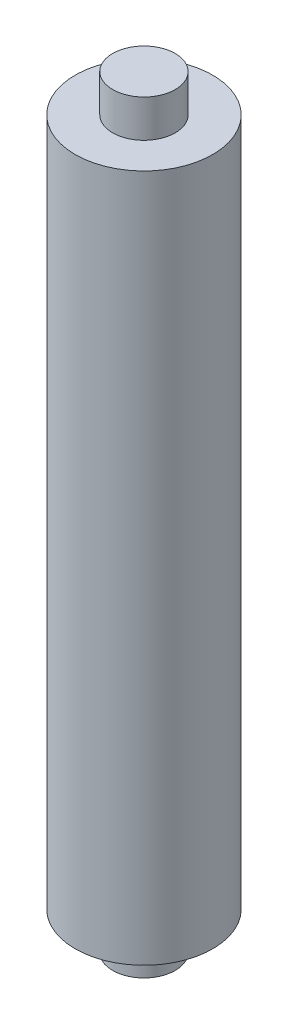
ISO-10303-21;
HEADER;
FILE_DESCRIPTION(('STEP AP214'),'2;1');
FILE_NAME('part.step','',(''),(''),'','','');
FILE_SCHEMA(('AUTOMOTIVE_DESIGN { 1 0 10303 214 1 1 1 1 }'));
ENDSEC;
DATA;
#1=APPLICATION_CONTEXT('core data for automotive mechanical design processes');
#2=APPLICATION_PROTOCOL_DEFINITION('international standard','automotive_design',2000,#1);
#3=PRODUCT_CONTEXT('',#1,'mechanical');
#4=PRODUCT('Part','Part','',(#3));
#5=PRODUCT_RELATED_PRODUCT_CATEGORY('part','',(#4));
#6=PRODUCT_DEFINITION_FORMATION('','',#4);
#7=PRODUCT_DEFINITION_CONTEXT('part definition',#1,'design');
#8=PRODUCT_DEFINITION('design','',#6,#7);
#9=PRODUCT_DEFINITION_SHAPE('','',#8);
#10=(LENGTH_UNIT() NAMED_UNIT(*) SI_UNIT(.MILLI.,.METRE.));
#11=(NAMED_UNIT(*) PLANE_ANGLE_UNIT() SI_UNIT($,.RADIAN.));
#12=(NAMED_UNIT(*) SI_UNIT($,.STERADIAN.) SOLID_ANGLE_UNIT());
#13=UNCERTAINTY_MEASURE_WITH_UNIT(LENGTH_MEASURE(1.E-05),#10,'distance_accuracy_value','');
#14=(GEOMETRIC_REPRESENTATION_CONTEXT(3) GLOBAL_UNCERTAINTY_ASSIGNED_CONTEXT((#13)) GLOBAL_UNIT_ASSIGNED_CONTEXT((#10,
#11,#12)) REPRESENTATION_CONTEXT('',''));
#15=CARTESIAN_POINT('',(0.,0.,0.));
#16=DIRECTION('',(0.,0.,1.));
#17=DIRECTION('',(1.,0.,0.));
#18=AXIS2_PLACEMENT_3D('',#15,#16,#17);
#19=CARTESIAN_POINT('',(0.,30.5,0.));
#20=DIRECTION('',(0.,-1.,0.));
#21=DIRECTION('',(0.,0.,-1.));
#22=AXIS2_PLACEMENT_3D('',#19,#20,#21);
#23=CYLINDRICAL_SURFACE('',#22,2.5);
#24=CARTESIAN_POINT('',(0.,27.5,0.));
#25=DIRECTION('',(0.,1.,0.));
#26=DIRECTION('',(0.,0.,1.));
#27=AXIS2_PLACEMENT_3D('',#24,#25,#26);
#28=CIRCLE('',#27,2.5);
#29=CARTESIAN_POINT('',(0.,27.5,-2.5));
#30=VERTEX_POINT('',#29);
#31=EDGE_CURVE('E42',#30,#30,#28,.T.);
#32=CARTESIAN_POINT('',(0.,30.5,0.));
#33=DIRECTION('',(0.,1.,0.));
#34=DIRECTION('',(0.,0.,1.));
#35=AXIS2_PLACEMENT_3D('',#32,#33,#34);
#36=CIRCLE('',#35,2.5);
#37=CARTESIAN_POINT('',(0.,30.5,-2.5));
#38=VERTEX_POINT('',#37);
#39=EDGE_CURVE('E46',#38,#38,#36,.T.);
#40=CARTESIAN_POINT('',(0.,27.5,-2.5));
#41=CARTESIAN_POINT('',(0.,27.53125,-2.5));
#42=CARTESIAN_POINT('',(0.,27.5625,-2.5));
#43=CARTESIAN_POINT('',(0.,27.625,-2.5));
#44=CARTESIAN_POINT('',(0.,27.65625,-2.5));
#45=CARTESIAN_POINT('',(0.,27.71875,-2.5));
#46=CARTESIAN_POINT('',(0.,27.75,-2.5));
#47=CARTESIAN_POINT('',(0.,27.8125,-2.5));
#48=CARTESIAN_POINT('',(0.,27.84375,-2.5));
#49=CARTESIAN_POINT('',(0.,27.90625,-2.5));
#50=CARTESIAN_POINT('',(0.,27.9375,-2.5));
#51=CARTESIAN_POINT('',(0.,28.,-2.5));
#52=CARTESIAN_POINT('',(0.,28.03125,-2.5));
#53=CARTESIAN_POINT('',(0.,28.09375,-2.5));
#54=CARTESIAN_POINT('',(0.,28.125,-2.5));
#55=CARTESIAN_POINT('',(0.,28.1875,-2.5));
#56=CARTESIAN_POINT('',(0.,28.21875,-2.5));
#57=CARTESIAN_POINT('',(0.,28.28125,-2.5));
#58=CARTESIAN_POINT('',(0.,28.3125,-2.5));
#59=CARTESIAN_POINT('',(0.,28.375,-2.5));
#60=CARTESIAN_POINT('',(0.,28.40625,-2.5));
#61=CARTESIAN_POINT('',(0.,28.46875,-2.5));
#62=CARTESIAN_POINT('',(0.,28.5,-2.5));
#63=CARTESIAN_POINT('',(0.,28.5625,-2.5));
#64=CARTESIAN_POINT('',(0.,28.59375,-2.5));
#65=CARTESIAN_POINT('',(0.,28.65625,-2.5));
#66=CARTESIAN_POINT('',(0.,28.6875,-2.5));
#67=CARTESIAN_POINT('',(0.,28.75,-2.5));
#68=CARTESIAN_POINT('',(0.,28.78125,-2.5));
#69=CARTESIAN_POINT('',(0.,28.84375,-2.5));
#70=CARTESIAN_POINT('',(0.,28.875,-2.5));
#71=CARTESIAN_POINT('',(0.,28.9375,-2.5));
#72=CARTESIAN_POINT('',(0.,28.96875,-2.5));
#73=CARTESIAN_POINT('',(0.,29.03125,-2.5));
#74=CARTESIAN_POINT('',(0.,29.0625,-2.5));
#75=CARTESIAN_POINT('',(0.,29.125,-2.5));
#76=CARTESIAN_POINT('',(0.,29.15625,-2.5));
#77=CARTESIAN_POINT('',(0.,29.21875,-2.5));
#78=CARTESIAN_POINT('',(0.,29.25,-2.5));
#79=CARTESIAN_POINT('',(0.,29.3125,-2.5));
#80=CARTESIAN_POINT('',(0.,29.34375,-2.5));
#81=CARTESIAN_POINT('',(0.,29.40625,-2.5));
#82=CARTESIAN_POINT('',(0.,29.4375,-2.5));
#83=CARTESIAN_POINT('',(0.,29.5,-2.5));
#84=CARTESIAN_POINT('',(0.,29.53125,-2.5));
#85=CARTESIAN_POINT('',(0.,29.59375,-2.5));
#86=CARTESIAN_POINT('',(0.,29.625,-2.5));
#87=CARTESIAN_POINT('',(0.,29.6875,-2.5));
#88=CARTESIAN_POINT('',(0.,29.71875,-2.5));
#89=CARTESIAN_POINT('',(0.,29.78125,-2.5));
#90=CARTESIAN_POINT('',(0.,29.8125,-2.5));
#91=CARTESIAN_POINT('',(0.,29.875,-2.5));
#92=CARTESIAN_POINT('',(0.,29.90625,-2.5));
#93=CARTESIAN_POINT('',(0.,29.96875,-2.5));
#94=CARTESIAN_POINT('',(0.,30.,-2.5));
#95=CARTESIAN_POINT('',(0.,30.0625,-2.5));
#96=CARTESIAN_POINT('',(0.,30.09375,-2.5));
#97=CARTESIAN_POINT('',(0.,30.15625,-2.5));
#98=CARTESIAN_POINT('',(0.,30.1875,-2.5));
#99=CARTESIAN_POINT('',(0.,30.25,-2.5));
#100=CARTESIAN_POINT('',(0.,30.28125,-2.5));
#101=CARTESIAN_POINT('',(0.,30.34375,-2.5));
#102=CARTESIAN_POINT('',(0.,30.375,-2.5));
#103=CARTESIAN_POINT('',(0.,30.4375,-2.5));
#104=CARTESIAN_POINT('',(0.,30.46875,-2.5));
#105=CARTESIAN_POINT('',(0.,30.5,-2.5));
#106=B_SPLINE_CURVE_WITH_KNOTS('',3,(#40,#41,#42,#43,#44,#45,#46,#47,#48,#49,#50,#51,#52,#53,
#54,#55,#56,#57,#58,#59,#60,#61,#62,#63,#64,#65,#66,#67,#68,#69,#70,#71,#72,#73,#74,#75,#76,#77,
#78,#79,#80,#81,#82,#83,#84,#85,#86,#87,#88,#89,#90,#91,#92,#93,#94,#95,#96,#97,#98,#99,#100,
#101,#102,#103,#104,#105),.UNSPECIFIED.,.F.,.F.,(4,2,2,2,2,2,2,2,2,2,2,2,2,2,2,2,2,2,2,2,2,2,2,
2,2,2,2,2,2,2,2,2,4),(0.,0.0937500000000001,0.1875,0.28125,0.374999999999997,0.46875,
0.562499999999997,0.656249999999997,0.749999999999997,0.843749999999997,0.937499999999997,
1.03125,1.125,1.21875,1.3125,1.40625,1.5,1.59375,1.6875,1.78125,1.875,1.96875,2.0625,2.15625,
2.25,2.34375,2.4375,2.53125,2.625,2.71875,2.8125,2.90625,3.),.UNSPECIFIED.);
#107=EDGE_CURVE('BSEAM39',#30,#38,#106,.T.);
#108=ORIENTED_EDGE('',*,*,#31,.T.);
#109=ORIENTED_EDGE('',*,*,#39,.F.);
#110=ORIENTED_EDGE('',*,*,#107,.T.);
#111=ORIENTED_EDGE('',*,*,#107,.F.);
#112=EDGE_LOOP('',(#108,#110,#109,#111));
#113=FACE_BOUND('',#112,.T.);
#114=ADVANCED_FACE('F39',(#113),#23,.T.);
#115=CARTESIAN_POINT('',(0.,30.5,0.));
#116=DIRECTION('',(0.,1.,0.));
#117=DIRECTION('',(0.,0.,1.));
#118=AXIS2_PLACEMENT_3D('',#115,#116,#117);
#119=PLANE('',#118);
#120=ORIENTED_EDGE('',*,*,#39,.T.);
#121=EDGE_LOOP('',(#120));
#122=FACE_BOUND('',#121,.T.);
#123=ADVANCED_FACE('F78',(#122),#119,.T.);
#124=CARTESIAN_POINT('',(0.,27.5,0.));
#125=DIRECTION('',(0.,-1.,0.));
#126=DIRECTION('',(0.,0.,-1.));
#127=AXIS2_PLACEMENT_3D('',#124,#125,#126);
#128=CYLINDRICAL_SURFACE('',#127,5.5);
#129=CARTESIAN_POINT('',(0.,27.5,0.));
#130=DIRECTION('',(0.,1.,0.));
#131=DIRECTION('',(0.,0.,1.));
#132=AXIS2_PLACEMENT_3D('',#129,#130,#131);
#133=CIRCLE('',#132,5.5);
#134=CARTESIAN_POINT('',(0.,27.5,5.5));
#135=VERTEX_POINT('',#134);
#136=EDGE_CURVE('E58',#135,#135,#133,.T.);
#137=ORIENTED_EDGE('',*,*,#136,.F.);
#138=EDGE_LOOP('',(#137));
#139=FACE_BOUND('',#138,.T.);
#140=CARTESIAN_POINT('',(0.,-27.5,0.));
#141=DIRECTION('',(0.,1.,0.));
#142=DIRECTION('',(0.,0.,1.));
#143=AXIS2_PLACEMENT_3D('',#140,#141,#142);
#144=CIRCLE('',#143,5.5);
#145=CARTESIAN_POINT('',(0.,-27.5,5.5));
#146=VERTEX_POINT('',#145);
#147=EDGE_CURVE('E55',#146,#146,#144,.T.);
#148=ORIENTED_EDGE('',*,*,#147,.T.);
#149=EDGE_LOOP('',(#148));
#150=FACE_BOUND('',#149,.T.);
#151=ADVANCED_FACE('F70',(#139,#150),#128,.T.);
#152=CARTESIAN_POINT('',(0.,27.5,0.));
#153=DIRECTION('',(0.,1.,0.));
#154=DIRECTION('',(0.,0.,1.));
#155=AXIS2_PLACEMENT_3D('',#152,#153,#154);
#156=PLANE('',#155);
#157=ORIENTED_EDGE('',*,*,#31,.F.);
#158=EDGE_LOOP('',(#157));
#159=FACE_BOUND('',#158,.T.);
#160=ORIENTED_EDGE('',*,*,#136,.T.);
#161=EDGE_LOOP('',(#160));
#162=FACE_BOUND('',#161,.T.);
#163=ADVANCED_FACE('F67',(#159,#162),#156,.T.);
#164=CARTESIAN_POINT('',(0.,-27.5,0.));
#165=DIRECTION('',(0.,1.,0.));
#166=DIRECTION('',(0.,0.,1.));
#167=AXIS2_PLACEMENT_3D('',#164,#165,#166);
#168=PLANE('',#167);
#169=CARTESIAN_POINT('',(0.,-27.5,0.));
#170=DIRECTION('',(0.,1.,0.));
#171=DIRECTION('',(0.,0.,1.));
#172=AXIS2_PLACEMENT_3D('',#169,#170,#171);
#173=CIRCLE('',#172,2.5);
#174=CARTESIAN_POINT('',(0.,-27.5,-2.5));
#175=VERTEX_POINT('',#174);
#176=EDGE_CURVE('E10',#175,#175,#173,.T.);
#177=ORIENTED_EDGE('',*,*,#176,.T.);
#178=EDGE_LOOP('',(#177));
#179=FACE_BOUND('',#178,.T.);
#180=ORIENTED_EDGE('',*,*,#147,.F.);
#181=EDGE_LOOP('',(#180));
#182=FACE_BOUND('',#181,.T.);
#183=ADVANCED_FACE('F69',(#179,#182),#168,.F.);
#184=CARTESIAN_POINT('',(0.,-30.5,0.));
#185=DIRECTION('',(0.,1.,0.));
#186=DIRECTION('',(0.,0.,1.));
#187=AXIS2_PLACEMENT_3D('',#184,#185,#186);
#188=PLANE('',#187);
#189=CARTESIAN_POINT('',(0.,-30.5,0.));
#190=DIRECTION('',(0.,1.,0.));
#191=DIRECTION('',(0.,0.,1.));
#192=AXIS2_PLACEMENT_3D('',#189,#190,#191);
#193=CIRCLE('',#192,2.5);
#194=CARTESIAN_POINT('',(0.,-30.5,-2.5));
#195=VERTEX_POINT('',#194);
#196=EDGE_CURVE('E50',#195,#195,#193,.T.);
#197=ORIENTED_EDGE('',*,*,#196,.F.);
#198=EDGE_LOOP('',(#197));
#199=FACE_BOUND('',#198,.T.);
#200=ADVANCED_FACE('F76',(#199),#188,.F.);
#201=CARTESIAN_POINT('',(0.,-30.5,-2.5));
#202=CARTESIAN_POINT('',(0.,-30.46875,-2.5));
#203=CARTESIAN_POINT('',(0.,-30.4375,-2.5));
#204=CARTESIAN_POINT('',(0.,-30.375,-2.5));
#205=CARTESIAN_POINT('',(0.,-30.34375,-2.5));
#206=CARTESIAN_POINT('',(0.,-30.28125,-2.5));
#207=CARTESIAN_POINT('',(0.,-30.25,-2.5));
#208=CARTESIAN_POINT('',(0.,-30.1875,-2.5));
#209=CARTESIAN_POINT('',(0.,-30.15625,-2.5));
#210=CARTESIAN_POINT('',(0.,-30.09375,-2.5));
#211=CARTESIAN_POINT('',(0.,-30.0625,-2.5));
#212=CARTESIAN_POINT('',(0.,-30.,-2.5));
#213=CARTESIAN_POINT('',(0.,-29.96875,-2.5));
#214=CARTESIAN_POINT('',(0.,-29.90625,-2.5));
#215=CARTESIAN_POINT('',(0.,-29.875,-2.5));
#216=CARTESIAN_POINT('',(0.,-29.8125,-2.5));
#217=CARTESIAN_POINT('',(0.,-29.78125,-2.5));
#218=CARTESIAN_POINT('',(0.,-29.71875,-2.5));
#219=CARTESIAN_POINT('',(0.,-29.6875,-2.5));
#220=CARTESIAN_POINT('',(0.,-29.625,-2.5));
#221=CARTESIAN_POINT('',(0.,-29.59375,-2.5));
#222=CARTESIAN_POINT('',(0.,-29.53125,-2.5));
#223=CARTESIAN_POINT('',(0.,-29.5,-2.5));
#224=CARTESIAN_POINT('',(0.,-29.4375,-2.5));
#225=CARTESIAN_POINT('',(0.,-29.40625,-2.5));
#226=CARTESIAN_POINT('',(0.,-29.34375,-2.5));
#227=CARTESIAN_POINT('',(0.,-29.3125,-2.5));
#228=CARTESIAN_POINT('',(0.,-29.25,-2.5));
#229=CARTESIAN_POINT('',(0.,-29.21875,-2.5));
#230=CARTESIAN_POINT('',(0.,-29.15625,-2.5));
#231=CARTESIAN_POINT('',(0.,-29.125,-2.5));
#232=CARTESIAN_POINT('',(0.,-29.0625,-2.5));
#233=CARTESIAN_POINT('',(0.,-29.03125,-2.5));
#234=CARTESIAN_POINT('',(0.,-28.96875,-2.5));
#235=CARTESIAN_POINT('',(0.,-28.9375,-2.5));
#236=CARTESIAN_POINT('',(0.,-28.875,-2.5));
#237=CARTESIAN_POINT('',(0.,-28.84375,-2.5));
#238=CARTESIAN_POINT('',(0.,-28.78125,-2.5));
#239=CARTESIAN_POINT('',(0.,-28.75,-2.5));
#240=CARTESIAN_POINT('',(0.,-28.6875,-2.5));
#241=CARTESIAN_POINT('',(0.,-28.65625,-2.5));
#242=CARTESIAN_POINT('',(0.,-28.59375,-2.5));
#243=CARTESIAN_POINT('',(0.,-28.5625,-2.5));
#244=CARTESIAN_POINT('',(0.,-28.5,-2.5));
#245=CARTESIAN_POINT('',(0.,-28.46875,-2.5));
#246=CARTESIAN_POINT('',(0.,-28.40625,-2.5));
#247=CARTESIAN_POINT('',(0.,-28.375,-2.5));
#248=CARTESIAN_POINT('',(0.,-28.3125,-2.5));
#249=CARTESIAN_POINT('',(0.,-28.28125,-2.5));
#250=CARTESIAN_POINT('',(0.,-28.21875,-2.5));
#251=CARTESIAN_POINT('',(0.,-28.1875,-2.5));
#252=CARTESIAN_POINT('',(0.,-28.125,-2.5));
#253=CARTESIAN_POINT('',(0.,-28.09375,-2.5));
#254=CARTESIAN_POINT('',(0.,-28.03125,-2.5));
#255=CARTESIAN_POINT('',(0.,-28.,-2.5));
#256=CARTESIAN_POINT('',(0.,-27.9375,-2.5));
#257=CARTESIAN_POINT('',(0.,-27.90625,-2.5));
#258=CARTESIAN_POINT('',(0.,-27.84375,-2.5));
#259=CARTESIAN_POINT('',(0.,-27.8125,-2.5));
#260=CARTESIAN_POINT('',(0.,-27.75,-2.5));
#261=CARTESIAN_POINT('',(0.,-27.71875,-2.5));
#262=CARTESIAN_POINT('',(0.,-27.65625,-2.5));
#263=CARTESIAN_POINT('',(0.,-27.625,-2.5));
#264=CARTESIAN_POINT('',(0.,-27.5625,-2.5));
#265=CARTESIAN_POINT('',(0.,-27.53125,-2.5));
#266=CARTESIAN_POINT('',(0.,-27.5,-2.5));
#267=B_SPLINE_CURVE_WITH_KNOTS('',3,(#201,#202,#203,#204,#205,#206,#207,#208,#209,#210,#211,
#212,#213,#214,#215,#216,#217,#218,#219,#220,#221,#222,#223,#224,#225,#226,#227,#228,#229,#230,
#231,#232,#233,#234,#235,#236,#237,#238,#239,#240,#241,#242,#243,#244,#245,#246,#247,#248,#249,
#250,#251,#252,#253,#254,#255,#256,#257,#258,#259,#260,#261,#262,#263,#264,#265,#266),
.UNSPECIFIED.,.F.,.F.,(4,2,2,2,2,2,2,2,2,2,2,2,2,2,2,2,2,2,2,2,2,2,2,2,2,2,2,2,2,2,2,2,4),(0.,
0.0937500000000036,0.1875,0.281249999999997,0.375,0.468750000000004,0.5625,0.656249999999997,
0.750000000000001,0.843750000000004,0.937500000000001,1.03125,1.125,1.21875,1.3125,1.40625,1.5,
1.59375,1.6875,1.78125,1.875,1.96875000000001,2.0625,2.15625,2.25,2.34375000000001,2.4375,
2.53125,2.625,2.71875000000001,2.8125,2.90625,3.),.UNSPECIFIED.);
#268=EDGE_CURVE('BSEAM82',#195,#175,#267,.T.);
#269=ORIENTED_EDGE('',*,*,#196,.T.);
#270=ORIENTED_EDGE('',*,*,#176,.F.);
#271=ORIENTED_EDGE('',*,*,#268,.T.);
#272=ORIENTED_EDGE('',*,*,#268,.F.);
#273=EDGE_LOOP('',(#269,#271,#270,#272));
#274=FACE_BOUND('',#273,.T.);
#275=ADVANCED_FACE('F82',(#274),#23,.T.);
#276=CLOSED_SHELL('',(#114,#123,#151,#163,#183,#200,#275));
#277=MANIFOLD_SOLID_BREP('B2',#276);
#278=ADVANCED_BREP_SHAPE_REPRESENTATION('',(#18,#277),#14);
#279=SHAPE_DEFINITION_REPRESENTATION(#9,#278);
ENDSEC;
END-ISO-10303-21;
